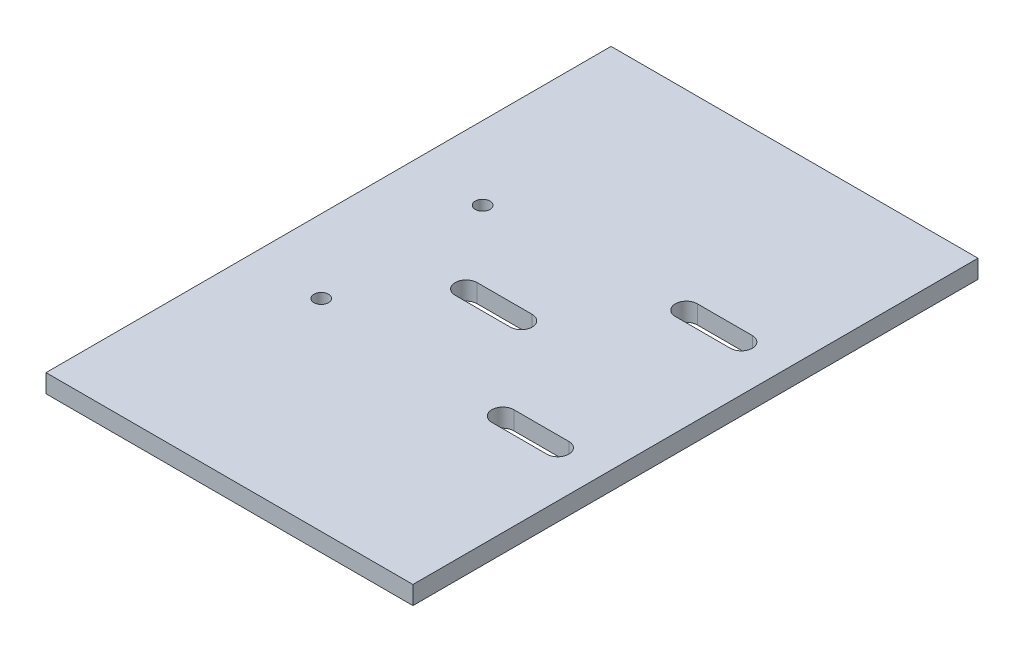
ISO-10303-21;
HEADER;
FILE_DESCRIPTION(('STEP AP214'),'2;1');
FILE_NAME('part.step','',(''),(''),'','','');
FILE_SCHEMA(('AUTOMOTIVE_DESIGN { 1 0 10303 214 1 1 1 1 }'));
ENDSEC;
DATA;
#1=APPLICATION_CONTEXT('core data for automotive mechanical design processes');
#2=APPLICATION_PROTOCOL_DEFINITION('international standard','automotive_design',2000,#1);
#3=PRODUCT_CONTEXT('',#1,'mechanical');
#4=PRODUCT('Part','Part','',(#3));
#5=PRODUCT_RELATED_PRODUCT_CATEGORY('part','',(#4));
#6=PRODUCT_DEFINITION_FORMATION('','',#4);
#7=PRODUCT_DEFINITION_CONTEXT('part definition',#1,'design');
#8=PRODUCT_DEFINITION('design','',#6,#7);
#9=PRODUCT_DEFINITION_SHAPE('','',#8);
#10=(LENGTH_UNIT() NAMED_UNIT(*) SI_UNIT(.MILLI.,.METRE.));
#11=(NAMED_UNIT(*) PLANE_ANGLE_UNIT() SI_UNIT($,.RADIAN.));
#12=(NAMED_UNIT(*) SI_UNIT($,.STERADIAN.) SOLID_ANGLE_UNIT());
#13=UNCERTAINTY_MEASURE_WITH_UNIT(LENGTH_MEASURE(1.E-05),#10,'distance_accuracy_value','');
#14=(GEOMETRIC_REPRESENTATION_CONTEXT(3) GLOBAL_UNCERTAINTY_ASSIGNED_CONTEXT((#13)) GLOBAL_UNIT_ASSIGNED_CONTEXT((#10,
#11,#12)) REPRESENTATION_CONTEXT('',''));
#15=CARTESIAN_POINT('',(0.,0.,0.));
#16=DIRECTION('',(0.,0.,1.));
#17=DIRECTION('',(1.,0.,0.));
#18=AXIS2_PLACEMENT_3D('',#15,#16,#17);
#19=CARTESIAN_POINT('',(0.,5.,0.));
#20=DIRECTION('',(0.,1.,0.));
#21=DIRECTION('',(0.,0.,1.));
#22=AXIS2_PLACEMENT_3D('',#19,#20,#21);
#23=PLANE('',#22);
#24=CARTESIAN_POINT('',(-6.65094339622642,5.,-73.6462264150943));
#25=DIRECTION('',(0.,1.,0.));
#26=DIRECTION('',(0.,0.,1.));
#27=AXIS2_PLACEMENT_3D('',#24,#25,#26);
#28=CIRCLE('',#27,2.);
#29=CARTESIAN_POINT('',(-6.65094339622642,5.,-71.6462264150943));
#30=VERTEX_POINT('',#29);
#31=EDGE_CURVE('E175',#30,#30,#28,.T.);
#32=ORIENTED_EDGE('',*,*,#31,.F.);
#33=EDGE_LOOP('',(#32));
#34=FACE_BOUND('',#33,.T.);
#35=DIRECTION('',(0.,0.,1.));
#36=VECTOR('',#35,1.);
#37=CARTESIAN_POINT('',(-26.6509433962264,5.,-128.646226415094));
#38=LINE('',#37,#36);
#39=CARTESIAN_POINT('',(-26.6509433962264,5.,-128.646226415094));
#40=VERTEX_POINT('',#39);
#41=CARTESIAN_POINT('',(-26.6509433962264,5.,25.3537735849057));
#42=VERTEX_POINT('',#41);
#43=EDGE_CURVE('E247',#40,#42,#38,.T.);
#44=ORIENTED_EDGE('',*,*,#43,.T.);
#45=DIRECTION('',(1.,0.,0.));
#46=VECTOR('',#45,1.);
#47=CARTESIAN_POINT('',(-26.6509433962264,5.,25.3537735849057));
#48=LINE('',#47,#46);
#49=CARTESIAN_POINT('',(73.3490566037736,5.,25.3537735849056));
#50=VERTEX_POINT('',#49);
#51=EDGE_CURVE('E250',#42,#50,#48,.T.);
#52=ORIENTED_EDGE('',*,*,#51,.T.);
#53=DIRECTION('',(0.,0.,-1.));
#54=VECTOR('',#53,1.);
#55=CARTESIAN_POINT('',(73.3490566037736,5.,-128.646226415094));
#56=LINE('',#55,#54);
#57=CARTESIAN_POINT('',(73.3490566037736,5.,-128.646226415094));
#58=VERTEX_POINT('',#57);
#59=EDGE_CURVE('E253',#50,#58,#56,.T.);
#60=ORIENTED_EDGE('',*,*,#59,.T.);
#61=DIRECTION('',(-1.,0.,0.));
#62=VECTOR('',#61,1.);
#63=CARTESIAN_POINT('',(-26.6509433962264,5.,-128.646226415094));
#64=LINE('',#63,#62);
#65=EDGE_CURVE('E255',#58,#40,#64,.T.);
#66=ORIENTED_EDGE('',*,*,#65,.T.);
#67=EDGE_LOOP('',(#44,#52,#60,#66));
#68=FACE_BOUND('',#67,.T.);
#69=DIRECTION('',(1.,0.,0.));
#70=VECTOR('',#69,1.);
#71=CARTESIAN_POINT('',(45.8490566037736,5.,-73.6462264150943));
#72=LINE('',#71,#70);
#73=CARTESIAN_POINT('',(45.8490566037736,5.,-73.6462264150943));
#74=VERTEX_POINT('',#73);
#75=CARTESIAN_POINT('',(60.8490566037736,5.,-73.6462264150943));
#76=VERTEX_POINT('',#75);
#77=EDGE_CURVE('E218',#74,#76,#72,.T.);
#78=ORIENTED_EDGE('',*,*,#77,.F.);
#79=CARTESIAN_POINT('',(45.8490566037736,5.,-76.6462264150943));
#80=DIRECTION('',(0.,1.,0.));
#81=DIRECTION('',(0.,0.,1.));
#82=AXIS2_PLACEMENT_3D('',#79,#80,#81);
#83=CIRCLE('',#82,3.);
#84=CARTESIAN_POINT('',(45.8490566037736,5.,-79.6462264150943));
#85=VERTEX_POINT('',#84);
#86=EDGE_CURVE('E216',#85,#74,#83,.T.);
#87=ORIENTED_EDGE('',*,*,#86,.F.);
#88=DIRECTION('',(-1.,0.,0.));
#89=VECTOR('',#88,1.);
#90=CARTESIAN_POINT('',(45.8490566037736,5.,-79.6462264150943));
#91=LINE('',#90,#89);
#92=CARTESIAN_POINT('',(60.8490566037736,5.,-79.6462264150943));
#93=VERTEX_POINT('',#92);
#94=EDGE_CURVE('E224',#93,#85,#91,.T.);
#95=ORIENTED_EDGE('',*,*,#94,.F.);
#96=CARTESIAN_POINT('',(60.8490566037736,5.,-76.6462264150943));
#97=DIRECTION('',(0.,1.,0.));
#98=DIRECTION('',(0.,0.,1.));
#99=AXIS2_PLACEMENT_3D('',#96,#97,#98);
#100=CIRCLE('',#99,3.);
#101=EDGE_CURVE('E221',#76,#93,#100,.T.);
#102=ORIENTED_EDGE('',*,*,#101,.F.);
#103=EDGE_LOOP('',(#78,#87,#95,#102));
#104=FACE_BOUND('',#103,.T.);
#105=DIRECTION('',(1.,0.,0.));
#106=VECTOR('',#105,1.);
#107=CARTESIAN_POINT('',(10.8490566037736,5.,-48.6462264150943));
#108=LINE('',#107,#106);
#109=CARTESIAN_POINT('',(10.8490566037736,5.,-48.6462264150943));
#110=VERTEX_POINT('',#109);
#111=CARTESIAN_POINT('',(25.8490566037736,5.,-48.6462264150943));
#112=VERTEX_POINT('',#111);
#113=EDGE_CURVE('E187',#110,#112,#108,.T.);
#114=ORIENTED_EDGE('',*,*,#113,.F.);
#115=CARTESIAN_POINT('',(10.8490566037736,5.,-51.6462264150943));
#116=DIRECTION('',(0.,1.,0.));
#117=DIRECTION('',(0.,0.,1.));
#118=AXIS2_PLACEMENT_3D('',#115,#116,#117);
#119=CIRCLE('',#118,3.);
#120=CARTESIAN_POINT('',(10.8490566037736,5.,-54.6462264150943));
#121=VERTEX_POINT('',#120);
#122=EDGE_CURVE('E185',#121,#110,#119,.T.);
#123=ORIENTED_EDGE('',*,*,#122,.F.);
#124=DIRECTION('',(-1.,0.,0.));
#125=VECTOR('',#124,1.);
#126=CARTESIAN_POINT('',(10.8490566037736,5.,-54.6462264150943));
#127=LINE('',#126,#125);
#128=CARTESIAN_POINT('',(25.8490566037736,5.,-54.6462264150943));
#129=VERTEX_POINT('',#128);
#130=EDGE_CURVE('E193',#129,#121,#127,.T.);
#131=ORIENTED_EDGE('',*,*,#130,.F.);
#132=CARTESIAN_POINT('',(25.8490566037736,5.,-51.6462264150943));
#133=DIRECTION('',(0.,1.,0.));
#134=DIRECTION('',(0.,0.,1.));
#135=AXIS2_PLACEMENT_3D('',#132,#133,#134);
#136=CIRCLE('',#135,3.);
#137=EDGE_CURVE('E190',#112,#129,#136,.T.);
#138=ORIENTED_EDGE('',*,*,#137,.F.);
#139=EDGE_LOOP('',(#114,#123,#131,#138));
#140=FACE_BOUND('',#139,.T.);
#141=DIRECTION('',(1.,0.,0.));
#142=VECTOR('',#141,1.);
#143=CARTESIAN_POINT('',(45.8490566037736,5.,-23.6462264150943));
#144=LINE('',#143,#142);
#145=CARTESIAN_POINT('',(45.8490566037736,5.,-23.6462264150943));
#146=VERTEX_POINT('',#145);
#147=CARTESIAN_POINT('',(60.8490566037736,5.,-23.6462264150943));
#148=VERTEX_POINT('',#147);
#149=EDGE_CURVE('E154',#146,#148,#144,.T.);
#150=ORIENTED_EDGE('',*,*,#149,.F.);
#151=CARTESIAN_POINT('',(45.8490566037736,5.,-26.6462264150943));
#152=DIRECTION('',(0.,1.,0.));
#153=DIRECTION('',(0.,0.,1.));
#154=AXIS2_PLACEMENT_3D('',#151,#152,#153);
#155=CIRCLE('',#154,3.00000000000001);
#156=CARTESIAN_POINT('',(45.8490566037736,5.,-29.6462264150943));
#157=VERTEX_POINT('',#156);
#158=EDGE_CURVE('E146',#157,#146,#155,.T.);
#159=ORIENTED_EDGE('',*,*,#158,.F.);
#160=DIRECTION('',(-1.,0.,0.));
#161=VECTOR('',#160,1.);
#162=CARTESIAN_POINT('',(45.8490566037736,5.,-29.6462264150943));
#163=LINE('',#162,#161);
#164=CARTESIAN_POINT('',(60.8490566037736,5.,-29.6462264150944));
#165=VERTEX_POINT('',#164);
#166=EDGE_CURVE('E169',#165,#157,#163,.T.);
#167=ORIENTED_EDGE('',*,*,#166,.F.);
#168=CARTESIAN_POINT('',(60.8490566037736,5.,-26.6462264150943));
#169=DIRECTION('',(0.,1.,0.));
#170=DIRECTION('',(0.,0.,1.));
#171=AXIS2_PLACEMENT_3D('',#168,#169,#170);
#172=CIRCLE('',#171,3.00000000000001);
#173=EDGE_CURVE('E167',#148,#165,#172,.T.);
#174=ORIENTED_EDGE('',*,*,#173,.F.);
#175=EDGE_LOOP('',(#150,#159,#167,#174));
#176=FACE_BOUND('',#175,.T.);
#177=CARTESIAN_POINT('',(-6.65094339622642,5.,-29.6462264150943));
#178=DIRECTION('',(0.,1.,0.));
#179=DIRECTION('',(0.,0.,-1.));
#180=AXIS2_PLACEMENT_3D('',#177,#178,#179);
#181=CIRCLE('',#180,2.);
#182=CARTESIAN_POINT('',(-6.65094339622642,5.,-31.6462264150943));
#183=VERTEX_POINT('',#182);
#184=EDGE_CURVE('E453',#183,#183,#181,.T.);
#185=ORIENTED_EDGE('',*,*,#184,.F.);
#186=EDGE_LOOP('',(#185));
#187=FACE_BOUND('',#186,.T.);
#188=ADVANCED_FACE('F33',(#34,#68,#104,#140,#176,#187),#23,.T.);
#189=CARTESIAN_POINT('',(0.,0.,0.));
#190=DIRECTION('',(0.,1.,0.));
#191=DIRECTION('',(0.,0.,1.));
#192=AXIS2_PLACEMENT_3D('',#189,#190,#191);
#193=PLANE('',#192);
#194=CARTESIAN_POINT('',(10.8490566037736,0.,-51.6462264150943));
#195=DIRECTION('',(0.,1.,0.));
#196=DIRECTION('',(0.,0.,1.));
#197=AXIS2_PLACEMENT_3D('',#194,#195,#196);
#198=CIRCLE('',#197,3.);
#199=CARTESIAN_POINT('',(10.8490566037736,0.,-54.6462264150943));
#200=VERTEX_POINT('',#199);
#201=CARTESIAN_POINT('',(10.8490566037736,0.,-48.6462264150943));
#202=VERTEX_POINT('',#201);
#203=EDGE_CURVE('E162',#200,#202,#198,.T.);
#204=ORIENTED_EDGE('',*,*,#203,.T.);
#205=DIRECTION('',(1.,0.,0.));
#206=VECTOR('',#205,1.);
#207=CARTESIAN_POINT('',(10.8490566037736,0.,-48.6462264150943));
#208=LINE('',#207,#206);
#209=CARTESIAN_POINT('',(25.8490566037736,0.,-48.6462264150943));
#210=VERTEX_POINT('',#209);
#211=EDGE_CURVE('E198',#202,#210,#208,.T.);
#212=ORIENTED_EDGE('',*,*,#211,.T.);
#213=CARTESIAN_POINT('',(25.8490566037736,0.,-51.6462264150943));
#214=DIRECTION('',(0.,1.,0.));
#215=DIRECTION('',(0.,0.,1.));
#216=AXIS2_PLACEMENT_3D('',#213,#214,#215);
#217=CIRCLE('',#216,3.);
#218=CARTESIAN_POINT('',(25.8490566037736,0.,-54.6462264150943));
#219=VERTEX_POINT('',#218);
#220=EDGE_CURVE('E201',#210,#219,#217,.T.);
#221=ORIENTED_EDGE('',*,*,#220,.T.);
#222=DIRECTION('',(-1.,0.,0.));
#223=VECTOR('',#222,1.);
#224=CARTESIAN_POINT('',(10.8490566037736,0.,-54.6462264150943));
#225=LINE('',#224,#223);
#226=EDGE_CURVE('E188',#219,#200,#225,.T.);
#227=ORIENTED_EDGE('',*,*,#226,.T.);
#228=EDGE_LOOP('',(#204,#212,#221,#227));
#229=FACE_BOUND('',#228,.T.);
#230=DIRECTION('',(0.,0.,1.));
#231=VECTOR('',#230,1.);
#232=CARTESIAN_POINT('',(-26.6509433962264,0.,-128.646226415094));
#233=LINE('',#232,#231);
#234=CARTESIAN_POINT('',(-26.6509433962264,0.,-128.646226415094));
#235=VERTEX_POINT('',#234);
#236=CARTESIAN_POINT('',(-26.6509433962264,0.,25.3537735849057));
#237=VERTEX_POINT('',#236);
#238=EDGE_CURVE('E246',#235,#237,#233,.T.);
#239=ORIENTED_EDGE('',*,*,#238,.F.);
#240=DIRECTION('',(-1.,0.,0.));
#241=VECTOR('',#240,1.);
#242=CARTESIAN_POINT('',(-26.6509433962264,0.,-128.646226415094));
#243=LINE('',#242,#241);
#244=CARTESIAN_POINT('',(73.3490566037736,0.,-128.646226415094));
#245=VERTEX_POINT('',#244);
#246=EDGE_CURVE('E251',#245,#235,#243,.T.);
#247=ORIENTED_EDGE('',*,*,#246,.F.);
#248=DIRECTION('',(0.,0.,-1.));
#249=VECTOR('',#248,1.);
#250=CARTESIAN_POINT('',(73.3490566037736,0.,-128.646226415094));
#251=LINE('',#250,#249);
#252=CARTESIAN_POINT('',(73.3490566037736,0.,25.3537735849056));
#253=VERTEX_POINT('',#252);
#254=EDGE_CURVE('E262',#253,#245,#251,.T.);
#255=ORIENTED_EDGE('',*,*,#254,.F.);
#256=DIRECTION('',(1.,0.,0.));
#257=VECTOR('',#256,1.);
#258=CARTESIAN_POINT('',(-26.6509433962264,0.,25.3537735849057));
#259=LINE('',#258,#257);
#260=EDGE_CURVE('E260',#237,#253,#259,.T.);
#261=ORIENTED_EDGE('',*,*,#260,.F.);
#262=EDGE_LOOP('',(#239,#247,#255,#261));
#263=FACE_BOUND('',#262,.T.);
#264=CARTESIAN_POINT('',(45.8490566037736,0.,-76.6462264150943));
#265=DIRECTION('',(0.,1.,0.));
#266=DIRECTION('',(0.,0.,1.));
#267=AXIS2_PLACEMENT_3D('',#264,#265,#266);
#268=CIRCLE('',#267,3.);
#269=CARTESIAN_POINT('',(45.8490566037736,0.,-79.6462264150943));
#270=VERTEX_POINT('',#269);
#271=CARTESIAN_POINT('',(45.8490566037736,0.,-73.6462264150943));
#272=VERTEX_POINT('',#271);
#273=EDGE_CURVE('E215',#270,#272,#268,.T.);
#274=ORIENTED_EDGE('',*,*,#273,.T.);
#275=DIRECTION('',(1.,0.,0.));
#276=VECTOR('',#275,1.);
#277=CARTESIAN_POINT('',(45.8490566037736,0.,-73.6462264150943));
#278=LINE('',#277,#276);
#279=CARTESIAN_POINT('',(60.8490566037736,0.,-73.6462264150943));
#280=VERTEX_POINT('',#279);
#281=EDGE_CURVE('E229',#272,#280,#278,.T.);
#282=ORIENTED_EDGE('',*,*,#281,.T.);
#283=CARTESIAN_POINT('',(60.8490566037736,0.,-76.6462264150943));
#284=DIRECTION('',(0.,1.,0.));
#285=DIRECTION('',(0.,0.,1.));
#286=AXIS2_PLACEMENT_3D('',#283,#284,#285);
#287=CIRCLE('',#286,3.);
#288=CARTESIAN_POINT('',(60.8490566037736,0.,-79.6462264150943));
#289=VERTEX_POINT('',#288);
#290=EDGE_CURVE('E232',#280,#289,#287,.T.);
#291=ORIENTED_EDGE('',*,*,#290,.T.);
#292=DIRECTION('',(-1.,0.,0.));
#293=VECTOR('',#292,1.);
#294=CARTESIAN_POINT('',(45.8490566037736,0.,-79.6462264150943));
#295=LINE('',#294,#293);
#296=EDGE_CURVE('E219',#289,#270,#295,.T.);
#297=ORIENTED_EDGE('',*,*,#296,.T.);
#298=EDGE_LOOP('',(#274,#282,#291,#297));
#299=FACE_BOUND('',#298,.T.);
#300=CARTESIAN_POINT('',(45.8490566037736,0.,-26.6462264150943));
#301=DIRECTION('',(0.,1.,0.));
#302=DIRECTION('',(0.,0.,1.));
#303=AXIS2_PLACEMENT_3D('',#300,#301,#302);
#304=CIRCLE('',#303,3.00000000000001);
#305=CARTESIAN_POINT('',(45.8490566037736,0.,-29.6462264150943));
#306=VERTEX_POINT('',#305);
#307=CARTESIAN_POINT('',(45.8490566037736,0.,-23.6462264150943));
#308=VERTEX_POINT('',#307);
#309=EDGE_CURVE('E56',#306,#308,#304,.T.);
#310=ORIENTED_EDGE('',*,*,#309,.T.);
#311=DIRECTION('',(1.,0.,0.));
#312=VECTOR('',#311,1.);
#313=CARTESIAN_POINT('',(45.8490566037736,0.,-23.6462264150943));
#314=LINE('',#313,#312);
#315=CARTESIAN_POINT('',(60.8490566037736,0.,-23.6462264150943));
#316=VERTEX_POINT('',#315);
#317=EDGE_CURVE('E161',#308,#316,#314,.T.);
#318=ORIENTED_EDGE('',*,*,#317,.T.);
#319=CARTESIAN_POINT('',(60.8490566037736,0.,-26.6462264150943));
#320=DIRECTION('',(0.,1.,0.));
#321=DIRECTION('',(0.,0.,1.));
#322=AXIS2_PLACEMENT_3D('',#319,#320,#321);
#323=CIRCLE('',#322,3.00000000000001);
#324=CARTESIAN_POINT('',(60.8490566037736,0.,-29.6462264150944));
#325=VERTEX_POINT('',#324);
#326=EDGE_CURVE('E177',#316,#325,#323,.T.);
#327=ORIENTED_EDGE('',*,*,#326,.T.);
#328=DIRECTION('',(-1.,0.,0.));
#329=VECTOR('',#328,1.);
#330=CARTESIAN_POINT('',(45.8490566037736,0.,-29.6462264150943));
#331=LINE('',#330,#329);
#332=EDGE_CURVE('E155',#325,#306,#331,.T.);
#333=ORIENTED_EDGE('',*,*,#332,.T.);
#334=EDGE_LOOP('',(#310,#318,#327,#333));
#335=FACE_BOUND('',#334,.T.);
#336=CARTESIAN_POINT('',(-6.65094339622642,0.,-73.6462264150943));
#337=DIRECTION('',(0.,1.,0.));
#338=DIRECTION('',(0.,0.,1.));
#339=AXIS2_PLACEMENT_3D('',#336,#337,#338);
#340=CIRCLE('',#339,2.);
#341=CARTESIAN_POINT('',(-6.65094339622642,0.,-71.6462264150943));
#342=VERTEX_POINT('',#341);
#343=EDGE_CURVE('E459',#342,#342,#340,.T.);
#344=ORIENTED_EDGE('',*,*,#343,.T.);
#345=EDGE_LOOP('',(#344));
#346=FACE_BOUND('',#345,.T.);
#347=CARTESIAN_POINT('',(-6.65094339622642,0.,-29.6462264150943));
#348=DIRECTION('',(0.,1.,0.));
#349=DIRECTION('',(0.,0.,-1.));
#350=AXIS2_PLACEMENT_3D('',#347,#348,#349);
#351=CIRCLE('',#350,2.);
#352=CARTESIAN_POINT('',(-6.65094339622642,0.,-31.6462264150943));
#353=VERTEX_POINT('',#352);
#354=EDGE_CURVE('E456',#353,#353,#351,.T.);
#355=ORIENTED_EDGE('',*,*,#354,.T.);
#356=EDGE_LOOP('',(#355));
#357=FACE_BOUND('',#356,.T.);
#358=ADVANCED_FACE('F280',(#229,#263,#299,#335,#346,#357),#193,.F.);
#359=CARTESIAN_POINT('',(-26.6509433962264,5.,-128.646226415094));
#360=DIRECTION('',(1.,0.,0.));
#361=DIRECTION('',(0.,0.,-1.));
#362=AXIS2_PLACEMENT_3D('',#359,#360,#361);
#363=PLANE('',#362);
#364=ORIENTED_EDGE('',*,*,#238,.T.);
#365=DIRECTION('',(0.,-1.,0.));
#366=VECTOR('',#365,1.);
#367=CARTESIAN_POINT('',(-26.6509433962264,5.,25.3537735849057));
#368=LINE('',#367,#366);
#369=EDGE_CURVE('E11',#42,#237,#368,.T.);
#370=ORIENTED_EDGE('',*,*,#369,.F.);
#371=ORIENTED_EDGE('',*,*,#43,.F.);
#372=DIRECTION('',(0.,-1.,0.));
#373=VECTOR('',#372,1.);
#374=CARTESIAN_POINT('',(-26.6509433962264,5.,-128.646226415094));
#375=LINE('',#374,#373);
#376=EDGE_CURVE('E257',#40,#235,#375,.T.);
#377=ORIENTED_EDGE('',*,*,#376,.T.);
#378=EDGE_LOOP('',(#364,#370,#371,#377));
#379=FACE_BOUND('',#378,.T.);
#380=ADVANCED_FACE('F35',(#379),#363,.F.);
#381=CARTESIAN_POINT('',(-26.6509433962264,5.,25.3537735849057));
#382=DIRECTION('',(0.,0.,-1.));
#383=DIRECTION('',(-1.,0.,0.));
#384=AXIS2_PLACEMENT_3D('',#381,#382,#383);
#385=PLANE('',#384);
#386=ORIENTED_EDGE('',*,*,#260,.T.);
#387=DIRECTION('',(0.,-1.,0.));
#388=VECTOR('',#387,1.);
#389=CARTESIAN_POINT('',(73.3490566037736,5.,25.3537735849056));
#390=LINE('',#389,#388);
#391=EDGE_CURVE('E41',#50,#253,#390,.T.);
#392=ORIENTED_EDGE('',*,*,#391,.F.);
#393=ORIENTED_EDGE('',*,*,#51,.F.);
#394=ORIENTED_EDGE('',*,*,#369,.T.);
#395=EDGE_LOOP('',(#386,#392,#393,#394));
#396=FACE_BOUND('',#395,.T.);
#397=ADVANCED_FACE('F291',(#396),#385,.F.);
#398=CARTESIAN_POINT('',(73.3490566037736,5.,-128.646226415094));
#399=DIRECTION('',(-1.,0.,0.));
#400=DIRECTION('',(0.,0.,1.));
#401=AXIS2_PLACEMENT_3D('',#398,#399,#400);
#402=PLANE('',#401);
#403=ORIENTED_EDGE('',*,*,#254,.T.);
#404=DIRECTION('',(0.,-1.,0.));
#405=VECTOR('',#404,1.);
#406=CARTESIAN_POINT('',(73.3490566037736,5.,-128.646226415094));
#407=LINE('',#406,#405);
#408=EDGE_CURVE('E267',#58,#245,#407,.T.);
#409=ORIENTED_EDGE('',*,*,#408,.F.);
#410=ORIENTED_EDGE('',*,*,#59,.F.);
#411=ORIENTED_EDGE('',*,*,#391,.T.);
#412=EDGE_LOOP('',(#403,#409,#410,#411));
#413=FACE_BOUND('',#412,.T.);
#414=ADVANCED_FACE('F274',(#413),#402,.F.);
#415=CARTESIAN_POINT('',(-26.6509433962264,5.,-128.646226415094));
#416=DIRECTION('',(0.,0.,1.));
#417=DIRECTION('',(1.,0.,0.));
#418=AXIS2_PLACEMENT_3D('',#415,#416,#417);
#419=PLANE('',#418);
#420=ORIENTED_EDGE('',*,*,#246,.T.);
#421=ORIENTED_EDGE('',*,*,#376,.F.);
#422=ORIENTED_EDGE('',*,*,#65,.F.);
#423=ORIENTED_EDGE('',*,*,#408,.T.);
#424=EDGE_LOOP('',(#420,#421,#422,#423));
#425=FACE_BOUND('',#424,.T.);
#426=ADVANCED_FACE('F284',(#425),#419,.F.);
#427=CARTESIAN_POINT('',(45.8490566037736,5.,-76.6462264150943));
#428=DIRECTION('',(0.,-1.,0.));
#429=DIRECTION('',(0.,0.,-1.));
#430=AXIS2_PLACEMENT_3D('',#427,#428,#429);
#431=CYLINDRICAL_SURFACE('',#430,3.);
#432=ORIENTED_EDGE('',*,*,#273,.F.);
#433=DIRECTION('',(0.,-1.,0.));
#434=VECTOR('',#433,1.);
#435=CARTESIAN_POINT('',(45.8490566037736,5.,-79.6462264150943));
#436=LINE('',#435,#434);
#437=EDGE_CURVE('E226',#85,#270,#436,.T.);
#438=ORIENTED_EDGE('',*,*,#437,.F.);
#439=ORIENTED_EDGE('',*,*,#86,.T.);
#440=DIRECTION('',(0.,-1.,0.));
#441=VECTOR('',#440,1.);
#442=CARTESIAN_POINT('',(45.8490566037736,5.,-73.6462264150943));
#443=LINE('',#442,#441);
#444=EDGE_CURVE('E243',#74,#272,#443,.T.);
#445=ORIENTED_EDGE('',*,*,#444,.T.);
#446=EDGE_LOOP('',(#432,#438,#439,#445));
#447=FACE_BOUND('',#446,.T.);
#448=ADVANCED_FACE('F308',(#447),#431,.F.);
#449=CARTESIAN_POINT('',(45.8490566037736,5.,-73.6462264150943));
#450=DIRECTION('',(0.,0.,-1.));
#451=DIRECTION('',(-1.,0.,0.));
#452=AXIS2_PLACEMENT_3D('',#449,#450,#451);
#453=PLANE('',#452);
#454=ORIENTED_EDGE('',*,*,#281,.F.);
#455=ORIENTED_EDGE('',*,*,#444,.F.);
#456=ORIENTED_EDGE('',*,*,#77,.T.);
#457=DIRECTION('',(0.,-1.,0.));
#458=VECTOR('',#457,1.);
#459=CARTESIAN_POINT('',(60.8490566037736,5.,-73.6462264150943));
#460=LINE('',#459,#458);
#461=EDGE_CURVE('E241',#76,#280,#460,.T.);
#462=ORIENTED_EDGE('',*,*,#461,.T.);
#463=EDGE_LOOP('',(#454,#455,#456,#462));
#464=FACE_BOUND('',#463,.T.);
#465=ADVANCED_FACE('F315',(#464),#453,.T.);
#466=CARTESIAN_POINT('',(60.8490566037736,5.,-76.6462264150943));
#467=DIRECTION('',(0.,-1.,0.));
#468=DIRECTION('',(0.,0.,-1.));
#469=AXIS2_PLACEMENT_3D('',#466,#467,#468);
#470=CYLINDRICAL_SURFACE('',#469,3.);
#471=ORIENTED_EDGE('',*,*,#290,.F.);
#472=ORIENTED_EDGE('',*,*,#461,.F.);
#473=ORIENTED_EDGE('',*,*,#101,.T.);
#474=DIRECTION('',(0.,-1.,0.));
#475=VECTOR('',#474,1.);
#476=CARTESIAN_POINT('',(60.8490566037736,5.,-79.6462264150943));
#477=LINE('',#476,#475);
#478=EDGE_CURVE('E239',#93,#289,#477,.T.);
#479=ORIENTED_EDGE('',*,*,#478,.T.);
#480=EDGE_LOOP('',(#471,#472,#473,#479));
#481=FACE_BOUND('',#480,.T.);
#482=ADVANCED_FACE('F320',(#481),#470,.F.);
#483=CARTESIAN_POINT('',(45.8490566037736,5.,-79.6462264150943));
#484=DIRECTION('',(0.,0.,1.));
#485=DIRECTION('',(1.,0.,0.));
#486=AXIS2_PLACEMENT_3D('',#483,#484,#485);
#487=PLANE('',#486);
#488=ORIENTED_EDGE('',*,*,#296,.F.);
#489=ORIENTED_EDGE('',*,*,#478,.F.);
#490=ORIENTED_EDGE('',*,*,#94,.T.);
#491=ORIENTED_EDGE('',*,*,#437,.T.);
#492=EDGE_LOOP('',(#488,#489,#490,#491));
#493=FACE_BOUND('',#492,.T.);
#494=ADVANCED_FACE('F327',(#493),#487,.T.);
#495=CARTESIAN_POINT('',(10.8490566037736,5.,-51.6462264150943));
#496=DIRECTION('',(0.,-1.,0.));
#497=DIRECTION('',(0.,0.,-1.));
#498=AXIS2_PLACEMENT_3D('',#495,#496,#497);
#499=CYLINDRICAL_SURFACE('',#498,3.);
#500=ORIENTED_EDGE('',*,*,#203,.F.);
#501=DIRECTION('',(0.,-1.,0.));
#502=VECTOR('',#501,1.);
#503=CARTESIAN_POINT('',(10.8490566037736,5.,-54.6462264150943));
#504=LINE('',#503,#502);
#505=EDGE_CURVE('E195',#121,#200,#504,.T.);
#506=ORIENTED_EDGE('',*,*,#505,.F.);
#507=ORIENTED_EDGE('',*,*,#122,.T.);
#508=DIRECTION('',(0.,-1.,0.));
#509=VECTOR('',#508,1.);
#510=CARTESIAN_POINT('',(10.8490566037736,5.,-48.6462264150943));
#511=LINE('',#510,#509);
#512=EDGE_CURVE('E212',#110,#202,#511,.T.);
#513=ORIENTED_EDGE('',*,*,#512,.T.);
#514=EDGE_LOOP('',(#500,#506,#507,#513));
#515=FACE_BOUND('',#514,.T.);
#516=ADVANCED_FACE('F349',(#515),#499,.F.);
#517=CARTESIAN_POINT('',(10.8490566037736,5.,-48.6462264150943));
#518=DIRECTION('',(0.,0.,-1.));
#519=DIRECTION('',(-1.,0.,0.));
#520=AXIS2_PLACEMENT_3D('',#517,#518,#519);
#521=PLANE('',#520);
#522=ORIENTED_EDGE('',*,*,#211,.F.);
#523=ORIENTED_EDGE('',*,*,#512,.F.);
#524=ORIENTED_EDGE('',*,*,#113,.T.);
#525=DIRECTION('',(0.,-1.,0.));
#526=VECTOR('',#525,1.);
#527=CARTESIAN_POINT('',(25.8490566037736,5.,-48.6462264150943));
#528=LINE('',#527,#526);
#529=EDGE_CURVE('E210',#112,#210,#528,.T.);
#530=ORIENTED_EDGE('',*,*,#529,.T.);
#531=EDGE_LOOP('',(#522,#523,#524,#530));
#532=FACE_BOUND('',#531,.T.);
#533=ADVANCED_FACE('F343',(#532),#521,.T.);
#534=CARTESIAN_POINT('',(25.8490566037736,5.,-51.6462264150943));
#535=DIRECTION('',(0.,-1.,0.));
#536=DIRECTION('',(0.,0.,-1.));
#537=AXIS2_PLACEMENT_3D('',#534,#535,#536);
#538=CYLINDRICAL_SURFACE('',#537,3.);
#539=ORIENTED_EDGE('',*,*,#220,.F.);
#540=ORIENTED_EDGE('',*,*,#529,.F.);
#541=ORIENTED_EDGE('',*,*,#137,.T.);
#542=DIRECTION('',(0.,-1.,0.));
#543=VECTOR('',#542,1.);
#544=CARTESIAN_POINT('',(25.8490566037736,5.,-54.6462264150943));
#545=LINE('',#544,#543);
#546=EDGE_CURVE('E208',#129,#219,#545,.T.);
#547=ORIENTED_EDGE('',*,*,#546,.T.);
#548=EDGE_LOOP('',(#539,#540,#541,#547));
#549=FACE_BOUND('',#548,.T.);
#550=ADVANCED_FACE('F346',(#549),#538,.F.);
#551=CARTESIAN_POINT('',(10.8490566037736,5.,-54.6462264150943));
#552=DIRECTION('',(0.,0.,1.));
#553=DIRECTION('',(1.,0.,0.));
#554=AXIS2_PLACEMENT_3D('',#551,#552,#553);
#555=PLANE('',#554);
#556=ORIENTED_EDGE('',*,*,#226,.F.);
#557=ORIENTED_EDGE('',*,*,#546,.F.);
#558=ORIENTED_EDGE('',*,*,#130,.T.);
#559=ORIENTED_EDGE('',*,*,#505,.T.);
#560=EDGE_LOOP('',(#556,#557,#558,#559));
#561=FACE_BOUND('',#560,.T.);
#562=ADVANCED_FACE('F352',(#561),#555,.T.);
#563=CARTESIAN_POINT('',(45.8490566037736,5.,-26.6462264150943));
#564=DIRECTION('',(0.,-1.,0.));
#565=DIRECTION('',(0.,0.,-1.));
#566=AXIS2_PLACEMENT_3D('',#563,#564,#565);
#567=CYLINDRICAL_SURFACE('',#566,3.00000000000001);
#568=ORIENTED_EDGE('',*,*,#309,.F.);
#569=DIRECTION('',(0.,-1.,0.));
#570=VECTOR('',#569,1.);
#571=CARTESIAN_POINT('',(45.8490566037736,5.,-29.6462264150943));
#572=LINE('',#571,#570);
#573=EDGE_CURVE('E150',#157,#306,#572,.T.);
#574=ORIENTED_EDGE('',*,*,#573,.F.);
#575=ORIENTED_EDGE('',*,*,#158,.T.);
#576=DIRECTION('',(0.,-1.,0.));
#577=VECTOR('',#576,1.);
#578=CARTESIAN_POINT('',(45.8490566037736,5.,-23.6462264150943));
#579=LINE('',#578,#577);
#580=EDGE_CURVE('E149',#146,#308,#579,.T.);
#581=ORIENTED_EDGE('',*,*,#580,.T.);
#582=EDGE_LOOP('',(#568,#574,#575,#581));
#583=FACE_BOUND('',#582,.T.);
#584=ADVANCED_FACE('F148',(#583),#567,.F.);
#585=CARTESIAN_POINT('',(45.8490566037736,5.,-23.6462264150943));
#586=DIRECTION('',(0.,0.,-1.));
#587=DIRECTION('',(-1.,0.,0.));
#588=AXIS2_PLACEMENT_3D('',#585,#586,#587);
#589=PLANE('',#588);
#590=ORIENTED_EDGE('',*,*,#317,.F.);
#591=ORIENTED_EDGE('',*,*,#580,.F.);
#592=ORIENTED_EDGE('',*,*,#149,.T.);
#593=DIRECTION('',(0.,-1.,0.));
#594=VECTOR('',#593,1.);
#595=CARTESIAN_POINT('',(60.8490566037736,5.,-23.6462264150943));
#596=LINE('',#595,#594);
#597=EDGE_CURVE('E163',#148,#316,#596,.T.);
#598=ORIENTED_EDGE('',*,*,#597,.T.);
#599=EDGE_LOOP('',(#590,#591,#592,#598));
#600=FACE_BOUND('',#599,.T.);
#601=ADVANCED_FACE('F158',(#600),#589,.T.);
#602=CARTESIAN_POINT('',(60.8490566037736,5.,-26.6462264150943));
#603=DIRECTION('',(0.,-1.,0.));
#604=DIRECTION('',(0.,0.,-1.));
#605=AXIS2_PLACEMENT_3D('',#602,#603,#604);
#606=CYLINDRICAL_SURFACE('',#605,3.00000000000001);
#607=ORIENTED_EDGE('',*,*,#326,.F.);
#608=ORIENTED_EDGE('',*,*,#597,.F.);
#609=ORIENTED_EDGE('',*,*,#173,.T.);
#610=DIRECTION('',(0.,-1.,0.));
#611=VECTOR('',#610,1.);
#612=CARTESIAN_POINT('',(60.8490566037736,5.,-29.6462264150944));
#613=LINE('',#612,#611);
#614=EDGE_CURVE('E48',#165,#325,#613,.T.);
#615=ORIENTED_EDGE('',*,*,#614,.T.);
#616=EDGE_LOOP('',(#607,#608,#609,#615));
#617=FACE_BOUND('',#616,.T.);
#618=ADVANCED_FACE('F409',(#617),#606,.F.);
#619=CARTESIAN_POINT('',(45.8490566037736,5.,-29.6462264150943));
#620=DIRECTION('',(0.,0.,1.));
#621=DIRECTION('',(1.,0.,0.));
#622=AXIS2_PLACEMENT_3D('',#619,#620,#621);
#623=PLANE('',#622);
#624=ORIENTED_EDGE('',*,*,#332,.F.);
#625=ORIENTED_EDGE('',*,*,#614,.F.);
#626=ORIENTED_EDGE('',*,*,#166,.T.);
#627=ORIENTED_EDGE('',*,*,#573,.T.);
#628=EDGE_LOOP('',(#624,#625,#626,#627));
#629=FACE_BOUND('',#628,.T.);
#630=ADVANCED_FACE('F417',(#629),#623,.T.);
#631=CARTESIAN_POINT('',(-6.65094339622642,5.,-73.6462264150943));
#632=DIRECTION('',(0.,-1.,0.));
#633=DIRECTION('',(0.,0.,-1.));
#634=AXIS2_PLACEMENT_3D('',#631,#632,#633);
#635=CYLINDRICAL_SURFACE('',#634,2.);
#636=ORIENTED_EDGE('',*,*,#31,.T.);
#637=EDGE_LOOP('',(#636));
#638=FACE_BOUND('',#637,.T.);
#639=ORIENTED_EDGE('',*,*,#343,.F.);
#640=EDGE_LOOP('',(#639));
#641=FACE_BOUND('',#640,.T.);
#642=ADVANCED_FACE('F427',(#638,#641),#635,.F.);
#643=CARTESIAN_POINT('',(-6.65094339622642,5.,-29.6462264150943));
#644=DIRECTION('',(0.,-1.,0.));
#645=DIRECTION('',(0.,0.,-1.));
#646=AXIS2_PLACEMENT_3D('',#643,#644,#645);
#647=CYLINDRICAL_SURFACE('',#646,2.);
#648=ORIENTED_EDGE('',*,*,#184,.T.);
#649=EDGE_LOOP('',(#648));
#650=FACE_BOUND('',#649,.T.);
#651=ORIENTED_EDGE('',*,*,#354,.F.);
#652=EDGE_LOOP('',(#651));
#653=FACE_BOUND('',#652,.T.);
#654=ADVANCED_FACE('F436',(#650,#653),#647,.F.);
#655=CLOSED_SHELL('',(#188,#358,#380,#397,#414,#426,#448,#465,#482,#494,#516,#533,#550,#562,
#584,#601,#618,#630,#642,#654));
#656=MANIFOLD_SOLID_BREP('B2',#655);
#657=ADVANCED_BREP_SHAPE_REPRESENTATION('',(#18,#656),#14);
#658=SHAPE_DEFINITION_REPRESENTATION(#9,#657);
ENDSEC;
END-ISO-10303-21;
